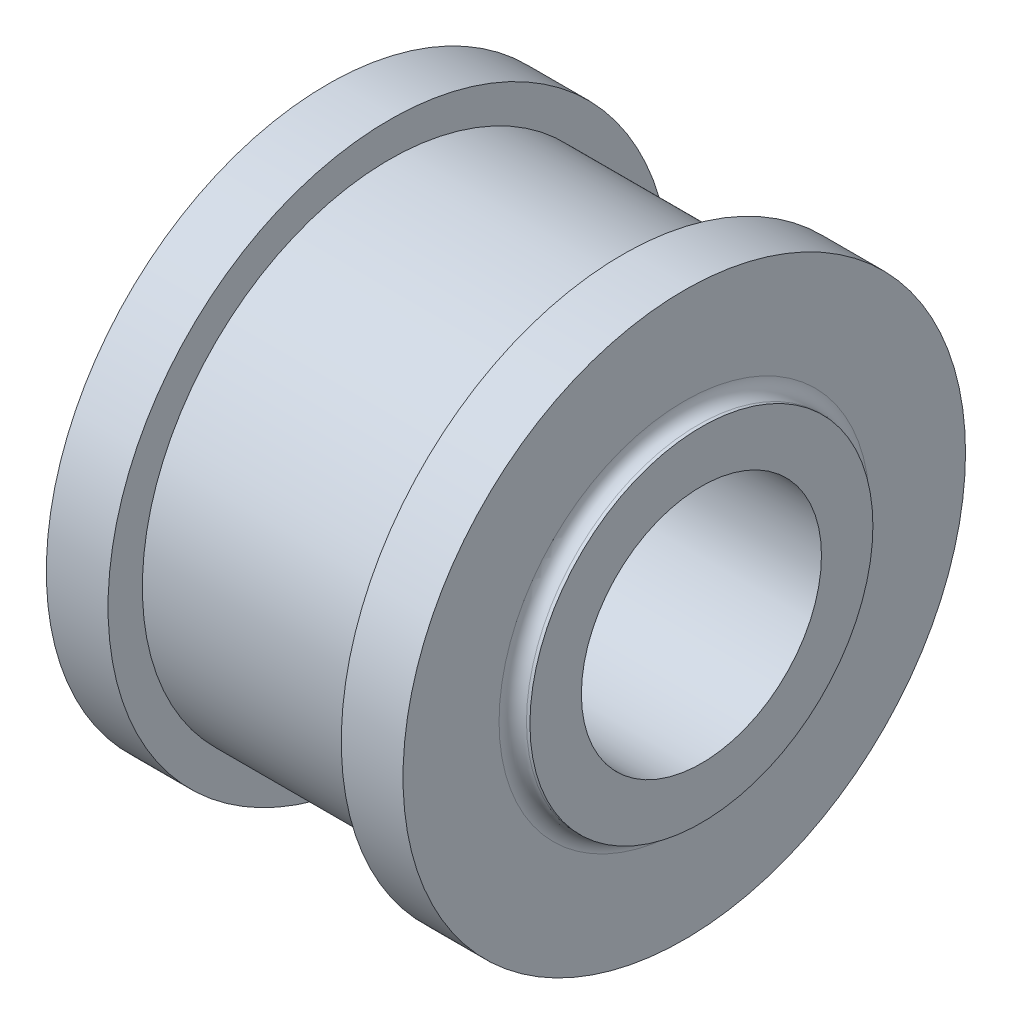
ISO-10303-21;
HEADER;
FILE_DESCRIPTION(('STEP AP214'),'2;1');
FILE_NAME('part.step','',(''),(''),'','','');
FILE_SCHEMA(('AUTOMOTIVE_DESIGN { 1 0 10303 214 1 1 1 1 }'));
ENDSEC;
DATA;
#1=APPLICATION_CONTEXT('core data for automotive mechanical design processes');
#2=APPLICATION_PROTOCOL_DEFINITION('international standard','automotive_design',2000,#1);
#3=PRODUCT_CONTEXT('',#1,'mechanical');
#4=PRODUCT('Part','Part','',(#3));
#5=PRODUCT_RELATED_PRODUCT_CATEGORY('part','',(#4));
#6=PRODUCT_DEFINITION_FORMATION('','',#4);
#7=PRODUCT_DEFINITION_CONTEXT('part definition',#1,'design');
#8=PRODUCT_DEFINITION('design','',#6,#7);
#9=PRODUCT_DEFINITION_SHAPE('','',#8);
#10=(LENGTH_UNIT() NAMED_UNIT(*) SI_UNIT(.MILLI.,.METRE.));
#11=(NAMED_UNIT(*) PLANE_ANGLE_UNIT() SI_UNIT($,.RADIAN.));
#12=(NAMED_UNIT(*) SI_UNIT($,.STERADIAN.) SOLID_ANGLE_UNIT());
#13=UNCERTAINTY_MEASURE_WITH_UNIT(LENGTH_MEASURE(1.E-05),#10,'distance_accuracy_value','');
#14=(GEOMETRIC_REPRESENTATION_CONTEXT(3) GLOBAL_UNCERTAINTY_ASSIGNED_CONTEXT((#13)) GLOBAL_UNIT_ASSIGNED_CONTEXT((#10,
#11,#12)) REPRESENTATION_CONTEXT('',''));
#15=CARTESIAN_POINT('',(0.,0.,0.));
#16=DIRECTION('',(0.,0.,1.));
#17=DIRECTION('',(1.,0.,0.));
#18=AXIS2_PLACEMENT_3D('',#15,#16,#17);
#19=CARTESIAN_POINT('',(-42.7718446601942,25.,0.));
#20=DIRECTION('',(-1.,0.,0.));
#21=DIRECTION('',(0.,0.,1.));
#22=AXIS2_PLACEMENT_3D('',#19,#20,#21);
#23=PLANE('',#22);
#24=CARTESIAN_POINT('',(-42.7718446601942,0.,0.));
#25=DIRECTION('',(1.,0.,0.));
#26=DIRECTION('',(0.,0.,-1.));
#27=AXIS2_PLACEMENT_3D('',#24,#25,#26);
#28=CIRCLE('',#27,17.5);
#29=CARTESIAN_POINT('',(-42.7718446601942,0.,-17.5));
#30=VERTEX_POINT('',#29);
#31=EDGE_CURVE('E61',#30,#30,#28,.T.);
#32=ORIENTED_EDGE('',*,*,#31,.T.);
#33=EDGE_LOOP('',(#32));
#34=FACE_BOUND('',#33,.T.);
#35=CARTESIAN_POINT('',(-42.7718446601942,0.,0.));
#36=DIRECTION('',(1.,0.,0.));
#37=DIRECTION('',(0.,0.,-1.));
#38=AXIS2_PLACEMENT_3D('',#35,#36,#37);
#39=CIRCLE('',#38,25.);
#40=CARTESIAN_POINT('',(-42.7718446601942,0.,-25.));
#41=VERTEX_POINT('',#40);
#42=EDGE_CURVE('E97',#41,#41,#39,.T.);
#43=ORIENTED_EDGE('',*,*,#42,.F.);
#44=EDGE_LOOP('',(#43));
#45=FACE_BOUND('',#44,.T.);
#46=ADVANCED_FACE('F37',(#34,#45),#23,.T.);
#47=CARTESIAN_POINT('',(0.,0.,0.));
#48=DIRECTION('',(1.,0.,0.));
#49=DIRECTION('',(0.,0.,-1.));
#50=AXIS2_PLACEMENT_3D('',#47,#48,#49);
#51=CYLINDRICAL_SURFACE('',#50,17.5);
#52=CARTESIAN_POINT('',(14.2281553398059,0.,0.));
#53=DIRECTION('',(1.,0.,0.));
#54=DIRECTION('',(0.,0.,-1.));
#55=AXIS2_PLACEMENT_3D('',#52,#53,#54);
#56=CIRCLE('',#55,17.5);
#57=CARTESIAN_POINT('',(14.2281553398059,0.,-17.5));
#58=VERTEX_POINT('',#57);
#59=EDGE_CURVE('E65',#58,#58,#56,.T.);
#60=ORIENTED_EDGE('',*,*,#59,.T.);
#61=EDGE_LOOP('',(#60));
#62=FACE_BOUND('',#61,.T.);
#63=ORIENTED_EDGE('',*,*,#31,.F.);
#64=EDGE_LOOP('',(#63));
#65=FACE_BOUND('',#64,.T.);
#66=ADVANCED_FACE('F105',(#62,#65),#51,.F.);
#67=CARTESIAN_POINT('',(14.2281553398059,17.5,0.));
#68=DIRECTION('',(1.,0.,0.));
#69=DIRECTION('',(0.,0.,-1.));
#70=AXIS2_PLACEMENT_3D('',#67,#68,#69);
#71=PLANE('',#70);
#72=CARTESIAN_POINT('',(14.2281553398059,0.,0.));
#73=DIRECTION('',(1.,0.,0.));
#74=DIRECTION('',(0.,0.,-1.));
#75=AXIS2_PLACEMENT_3D('',#72,#73,#74);
#76=CIRCLE('',#75,25.);
#77=CARTESIAN_POINT('',(14.2281553398059,0.,-25.));
#78=VERTEX_POINT('',#77);
#79=EDGE_CURVE('E69',#78,#78,#76,.T.);
#80=ORIENTED_EDGE('',*,*,#79,.T.);
#81=EDGE_LOOP('',(#80));
#82=FACE_BOUND('',#81,.T.);
#83=ORIENTED_EDGE('',*,*,#59,.F.);
#84=EDGE_LOOP('',(#83));
#85=FACE_BOUND('',#84,.T.);
#86=ADVANCED_FACE('F111',(#82,#85),#71,.T.);
#87=CARTESIAN_POINT('',(0.,0.,0.));
#88=DIRECTION('',(1.,0.,0.));
#89=DIRECTION('',(0.,0.,-1.));
#90=AXIS2_PLACEMENT_3D('',#87,#88,#89);
#91=CYLINDRICAL_SURFACE('',#90,25.);
#92=CARTESIAN_POINT('',(13.7281553398059,0.,0.));
#93=DIRECTION('',(1.,0.,0.));
#94=DIRECTION('',(0.,0.,-1.));
#95=AXIS2_PLACEMENT_3D('',#92,#93,#94);
#96=CIRCLE('',#95,25.);
#97=CARTESIAN_POINT('',(13.7281553398059,0.,-25.));
#98=VERTEX_POINT('',#97);
#99=EDGE_CURVE('E55',#98,#98,#96,.T.);
#100=ORIENTED_EDGE('',*,*,#99,.T.);
#101=EDGE_LOOP('',(#100));
#102=FACE_BOUND('',#101,.T.);
#103=ORIENTED_EDGE('',*,*,#79,.F.);
#104=EDGE_LOOP('',(#103));
#105=FACE_BOUND('',#104,.T.);
#106=ADVANCED_FACE('F129',(#102,#105),#91,.T.);
#107=CARTESIAN_POINT('',(11.7281553398059,25.,0.));
#108=DIRECTION('',(1.,0.,0.));
#109=DIRECTION('',(0.,0.,-1.));
#110=AXIS2_PLACEMENT_3D('',#107,#108,#109);
#111=PLANE('',#110);
#112=CARTESIAN_POINT('',(11.7281553398059,0.,0.));
#113=DIRECTION('',(1.,0.,0.));
#114=DIRECTION('',(0.,0.,-1.));
#115=AXIS2_PLACEMENT_3D('',#112,#113,#114);
#116=CIRCLE('',#115,27.);
#117=CARTESIAN_POINT('',(11.7281553398059,0.,-27.));
#118=VERTEX_POINT('',#117);
#119=EDGE_CURVE('E50',#118,#118,#116,.F.);
#120=ORIENTED_EDGE('',*,*,#119,.T.);
#121=EDGE_LOOP('',(#120));
#122=FACE_BOUND('',#121,.T.);
#123=CARTESIAN_POINT('',(11.7281553398059,0.,0.));
#124=DIRECTION('',(1.,0.,0.));
#125=DIRECTION('',(0.,0.,-1.));
#126=AXIS2_PLACEMENT_3D('',#123,#124,#125);
#127=CIRCLE('',#126,41.);
#128=CARTESIAN_POINT('',(11.7281553398059,0.,-41.));
#129=VERTEX_POINT('',#128);
#130=EDGE_CURVE('E73',#129,#129,#127,.T.);
#131=ORIENTED_EDGE('',*,*,#130,.T.);
#132=EDGE_LOOP('',(#131));
#133=FACE_BOUND('',#132,.T.);
#134=ADVANCED_FACE('F132',(#122,#133),#111,.T.);
#135=CARTESIAN_POINT('',(0.,0.,0.));
#136=DIRECTION('',(1.,0.,0.));
#137=DIRECTION('',(0.,0.,-1.));
#138=AXIS2_PLACEMENT_3D('',#135,#136,#137);
#139=CYLINDRICAL_SURFACE('',#138,41.);
#140=CARTESIAN_POINT('',(2.72815533980585,0.,0.));
#141=DIRECTION('',(1.,0.,0.));
#142=DIRECTION('',(0.,0.,-1.));
#143=AXIS2_PLACEMENT_3D('',#140,#141,#142);
#144=CIRCLE('',#143,41.);
#145=CARTESIAN_POINT('',(2.72815533980585,0.,-41.));
#146=VERTEX_POINT('',#145);
#147=EDGE_CURVE('E77',#146,#146,#144,.T.);
#148=ORIENTED_EDGE('',*,*,#147,.T.);
#149=EDGE_LOOP('',(#148));
#150=FACE_BOUND('',#149,.T.);
#151=ORIENTED_EDGE('',*,*,#130,.F.);
#152=EDGE_LOOP('',(#151));
#153=FACE_BOUND('',#152,.T.);
#154=ADVANCED_FACE('F146',(#150,#153),#139,.T.);
#155=CARTESIAN_POINT('',(2.72815533980585,41.,0.));
#156=DIRECTION('',(-1.,0.,0.));
#157=DIRECTION('',(0.,0.,1.));
#158=AXIS2_PLACEMENT_3D('',#155,#156,#157);
#159=PLANE('',#158);
#160=CARTESIAN_POINT('',(2.72815533980585,0.,0.));
#161=DIRECTION('',(1.,0.,0.));
#162=DIRECTION('',(0.,0.,-1.));
#163=AXIS2_PLACEMENT_3D('',#160,#161,#162);
#164=CIRCLE('',#163,36.);
#165=CARTESIAN_POINT('',(2.72815533980585,0.,-36.));
#166=VERTEX_POINT('',#165);
#167=EDGE_CURVE('E81',#166,#166,#164,.T.);
#168=ORIENTED_EDGE('',*,*,#167,.T.);
#169=EDGE_LOOP('',(#168));
#170=FACE_BOUND('',#169,.T.);
#171=ORIENTED_EDGE('',*,*,#147,.F.);
#172=EDGE_LOOP('',(#171));
#173=FACE_BOUND('',#172,.T.);
#174=ADVANCED_FACE('F150',(#170,#173),#159,.T.);
#175=CARTESIAN_POINT('',(0.,0.,0.));
#176=DIRECTION('',(1.,0.,0.));
#177=DIRECTION('',(0.,0.,-1.));
#178=AXIS2_PLACEMENT_3D('',#175,#176,#177);
#179=CYLINDRICAL_SURFACE('',#178,36.);
#180=CARTESIAN_POINT('',(-31.2718446601941,0.,0.));
#181=DIRECTION('',(1.,0.,0.));
#182=DIRECTION('',(0.,0.,-1.));
#183=AXIS2_PLACEMENT_3D('',#180,#181,#182);
#184=CIRCLE('',#183,36.);
#185=CARTESIAN_POINT('',(-31.2718446601941,0.,-36.));
#186=VERTEX_POINT('',#185);
#187=EDGE_CURVE('E85',#186,#186,#184,.T.);
#188=ORIENTED_EDGE('',*,*,#187,.T.);
#189=EDGE_LOOP('',(#188));
#190=FACE_BOUND('',#189,.T.);
#191=ORIENTED_EDGE('',*,*,#167,.F.);
#192=EDGE_LOOP('',(#191));
#193=FACE_BOUND('',#192,.T.);
#194=ADVANCED_FACE('F154',(#190,#193),#179,.T.);
#195=CARTESIAN_POINT('',(-31.2718446601941,36.,0.));
#196=DIRECTION('',(1.,0.,0.));
#197=DIRECTION('',(0.,0.,-1.));
#198=AXIS2_PLACEMENT_3D('',#195,#196,#197);
#199=PLANE('',#198);
#200=CARTESIAN_POINT('',(-31.2718446601941,0.,0.));
#201=DIRECTION('',(1.,0.,0.));
#202=DIRECTION('',(0.,0.,-1.));
#203=AXIS2_PLACEMENT_3D('',#200,#201,#202);
#204=CIRCLE('',#203,41.);
#205=CARTESIAN_POINT('',(-31.2718446601941,0.,-41.));
#206=VERTEX_POINT('',#205);
#207=EDGE_CURVE('E89',#206,#206,#204,.T.);
#208=ORIENTED_EDGE('',*,*,#207,.T.);
#209=EDGE_LOOP('',(#208));
#210=FACE_BOUND('',#209,.T.);
#211=ORIENTED_EDGE('',*,*,#187,.F.);
#212=EDGE_LOOP('',(#211));
#213=FACE_BOUND('',#212,.T.);
#214=ADVANCED_FACE('F158',(#210,#213),#199,.T.);
#215=CARTESIAN_POINT('',(0.,0.,0.));
#216=DIRECTION('',(1.,0.,0.));
#217=DIRECTION('',(0.,0.,-1.));
#218=AXIS2_PLACEMENT_3D('',#215,#216,#217);
#219=CYLINDRICAL_SURFACE('',#218,41.);
#220=CARTESIAN_POINT('',(-40.2718446601941,0.,0.));
#221=DIRECTION('',(1.,0.,0.));
#222=DIRECTION('',(0.,0.,-1.));
#223=AXIS2_PLACEMENT_3D('',#220,#221,#222);
#224=CIRCLE('',#223,41.);
#225=CARTESIAN_POINT('',(-40.2718446601941,0.,-41.));
#226=VERTEX_POINT('',#225);
#227=EDGE_CURVE('E93',#226,#226,#224,.T.);
#228=ORIENTED_EDGE('',*,*,#227,.T.);
#229=EDGE_LOOP('',(#228));
#230=FACE_BOUND('',#229,.T.);
#231=ORIENTED_EDGE('',*,*,#207,.F.);
#232=EDGE_LOOP('',(#231));
#233=FACE_BOUND('',#232,.T.);
#234=ADVANCED_FACE('F162',(#230,#233),#219,.T.);
#235=CARTESIAN_POINT('',(-40.2718446601941,41.,0.));
#236=DIRECTION('',(-1.,0.,0.));
#237=DIRECTION('',(0.,0.,1.));
#238=AXIS2_PLACEMENT_3D('',#235,#236,#237);
#239=PLANE('',#238);
#240=CARTESIAN_POINT('',(-40.2718446601941,0.,0.));
#241=DIRECTION('',(-1.,0.,0.));
#242=DIRECTION('',(0.,0.,1.));
#243=AXIS2_PLACEMENT_3D('',#240,#241,#242);
#244=CIRCLE('',#243,27.);
#245=CARTESIAN_POINT('',(-40.2718446601941,0.,27.));
#246=VERTEX_POINT('',#245);
#247=EDGE_CURVE('E45',#246,#246,#244,.F.);
#248=ORIENTED_EDGE('',*,*,#247,.T.);
#249=EDGE_LOOP('',(#248));
#250=FACE_BOUND('',#249,.T.);
#251=ORIENTED_EDGE('',*,*,#227,.F.);
#252=EDGE_LOOP('',(#251));
#253=FACE_BOUND('',#252,.T.);
#254=ADVANCED_FACE('F123',(#250,#253),#239,.T.);
#255=CARTESIAN_POINT('',(0.,0.,0.));
#256=DIRECTION('',(1.,0.,0.));
#257=DIRECTION('',(0.,0.,-1.));
#258=AXIS2_PLACEMENT_3D('',#255,#256,#257);
#259=CYLINDRICAL_SURFACE('',#258,25.);
#260=CARTESIAN_POINT('',(-42.2718446601942,0.,0.));
#261=DIRECTION('',(-1.,0.,0.));
#262=DIRECTION('',(0.,0.,1.));
#263=AXIS2_PLACEMENT_3D('',#260,#261,#262);
#264=CIRCLE('',#263,25.);
#265=CARTESIAN_POINT('',(-42.2718446601942,0.,25.));
#266=VERTEX_POINT('',#265);
#267=EDGE_CURVE('E10',#266,#266,#264,.T.);
#268=ORIENTED_EDGE('',*,*,#267,.T.);
#269=EDGE_LOOP('',(#268));
#270=FACE_BOUND('',#269,.T.);
#271=ORIENTED_EDGE('',*,*,#42,.T.);
#272=EDGE_LOOP('',(#271));
#273=FACE_BOUND('',#272,.T.);
#274=ADVANCED_FACE('F102',(#270,#273),#259,.T.);
#275=CARTESIAN_POINT('',(13.7281553398059,0.,0.));
#276=DIRECTION('',(1.,0.,0.));
#277=DIRECTION('',(0.,0.,-1.));
#278=AXIS2_PLACEMENT_3D('',#275,#276,#277);
#279=TOROIDAL_SURFACE('',#278,27.,2.);
#280=ORIENTED_EDGE('',*,*,#119,.F.);
#281=EDGE_LOOP('',(#280));
#282=FACE_BOUND('',#281,.T.);
#283=ORIENTED_EDGE('',*,*,#99,.F.);
#284=EDGE_LOOP('',(#283));
#285=FACE_BOUND('',#284,.T.);
#286=ADVANCED_FACE('F115',(#282,#285),#279,.F.);
#287=CARTESIAN_POINT('',(-42.2718446601942,0.,0.));
#288=DIRECTION('',(-1.,0.,0.));
#289=DIRECTION('',(0.,0.,1.));
#290=AXIS2_PLACEMENT_3D('',#287,#288,#289);
#291=TOROIDAL_SURFACE('',#290,27.,2.);
#292=ORIENTED_EDGE('',*,*,#267,.F.);
#293=EDGE_LOOP('',(#292));
#294=FACE_BOUND('',#293,.T.);
#295=ORIENTED_EDGE('',*,*,#247,.F.);
#296=EDGE_LOOP('',(#295));
#297=FACE_BOUND('',#296,.T.);
#298=ADVANCED_FACE('F39',(#294,#297),#291,.F.);
#299=CLOSED_SHELL('',(#46,#66,#86,#106,#134,#154,#174,#194,#214,#234,#254,#274,#286,#298));
#300=MANIFOLD_SOLID_BREP('B2',#299);
#301=ADVANCED_BREP_SHAPE_REPRESENTATION('',(#18,#300),#14);
#302=SHAPE_DEFINITION_REPRESENTATION(#9,#301);
ENDSEC;
END-ISO-10303-21;
